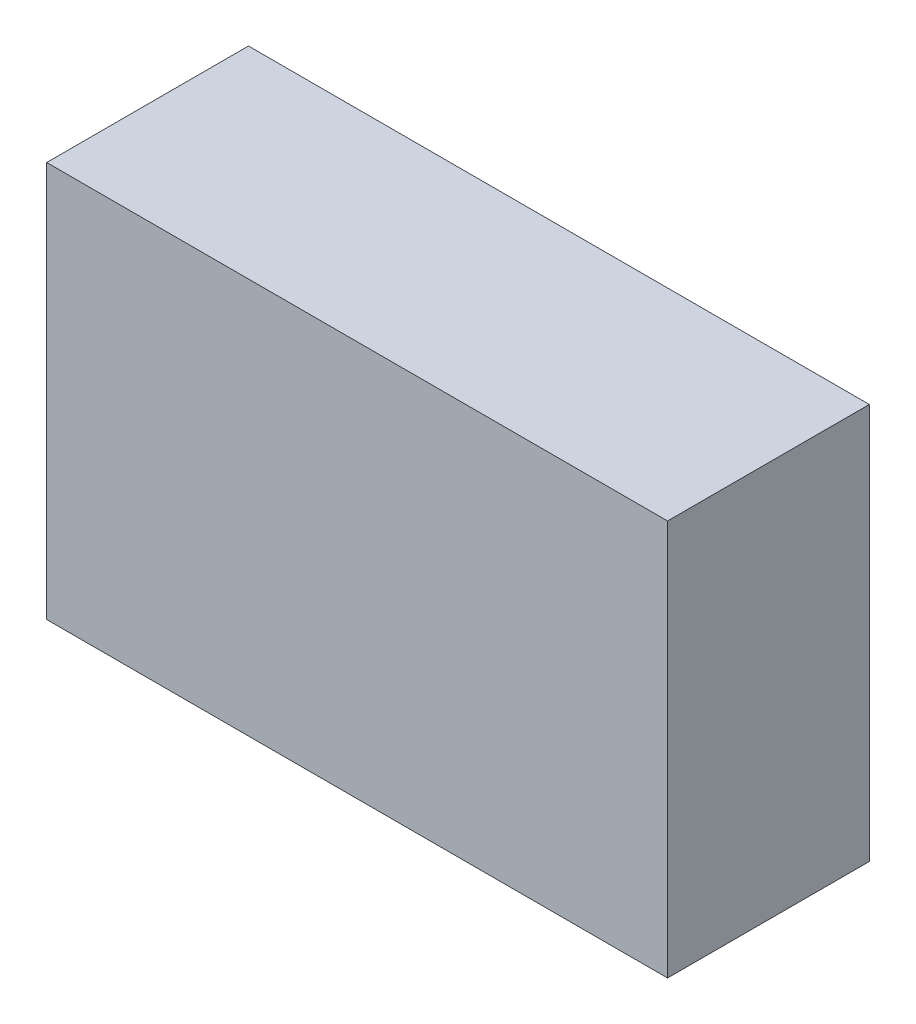
ISO-10303-21;
HEADER;
FILE_DESCRIPTION(('STEP AP214'),'2;1');
FILE_NAME('part.step','',(''),(''),'','','');
FILE_SCHEMA(('AUTOMOTIVE_DESIGN { 1 0 10303 214 1 1 1 1 }'));
ENDSEC;
DATA;
#1=APPLICATION_CONTEXT('core data for automotive mechanical design processes');
#2=APPLICATION_PROTOCOL_DEFINITION('international standard','automotive_design',2000,#1);
#3=PRODUCT_CONTEXT('',#1,'mechanical');
#4=PRODUCT('Part','Part','',(#3));
#5=PRODUCT_RELATED_PRODUCT_CATEGORY('part','',(#4));
#6=PRODUCT_DEFINITION_FORMATION('','',#4);
#7=PRODUCT_DEFINITION_CONTEXT('part definition',#1,'design');
#8=PRODUCT_DEFINITION('design','',#6,#7);
#9=PRODUCT_DEFINITION_SHAPE('','',#8);
#10=(LENGTH_UNIT() NAMED_UNIT(*) SI_UNIT(.MILLI.,.METRE.));
#11=(NAMED_UNIT(*) PLANE_ANGLE_UNIT() SI_UNIT($,.RADIAN.));
#12=(NAMED_UNIT(*) SI_UNIT($,.STERADIAN.) SOLID_ANGLE_UNIT());
#13=UNCERTAINTY_MEASURE_WITH_UNIT(LENGTH_MEASURE(1.E-05),#10,'distance_accuracy_value','');
#14=(GEOMETRIC_REPRESENTATION_CONTEXT(3) GLOBAL_UNCERTAINTY_ASSIGNED_CONTEXT((#13)) GLOBAL_UNIT_ASSIGNED_CONTEXT((#10,
#11,#12)) REPRESENTATION_CONTEXT('',''));
#15=CARTESIAN_POINT('',(0.,0.,0.));
#16=DIRECTION('',(0.,0.,1.));
#17=DIRECTION('',(1.,0.,0.));
#18=AXIS2_PLACEMENT_3D('',#15,#16,#17);
#19=CARTESIAN_POINT('',(-32.,-132.9,228.6));
#20=DIRECTION('',(0.,0.,1.));
#21=DIRECTION('',(1.,0.,0.));
#22=AXIS2_PLACEMENT_3D('',#19,#20,#21);
#23=PLANE('',#22);
#24=DIRECTION('',(0.,-1.,0.));
#25=VECTOR('',#24,1.);
#26=CARTESIAN_POINT('',(-32.,-132.9,228.6));
#27=LINE('',#26,#25);
#28=CARTESIAN_POINT('',(-32.,-132.9,228.6));
#29=VERTEX_POINT('',#28);
#30=CARTESIAN_POINT('',(-32.,-143.1,228.6));
#31=VERTEX_POINT('',#30);
#32=EDGE_CURVE('E69',#29,#31,#27,.T.);
#33=ORIENTED_EDGE('',*,*,#32,.F.);
#34=DIRECTION('',(-1.,0.,0.));
#35=VECTOR('',#34,1.);
#36=CARTESIAN_POINT('',(-32.,-132.9,228.6));
#37=LINE('',#36,#35);
#38=CARTESIAN_POINT('',(-48.,-132.9,228.6));
#39=VERTEX_POINT('',#38);
#40=EDGE_CURVE('E64',#29,#39,#37,.T.);
#41=ORIENTED_EDGE('',*,*,#40,.T.);
#42=DIRECTION('',(0.,-1.,0.));
#43=VECTOR('',#42,1.);
#44=CARTESIAN_POINT('',(-48.,-132.9,228.6));
#45=LINE('',#44,#43);
#46=CARTESIAN_POINT('',(-48.,-143.1,228.6));
#47=VERTEX_POINT('',#46);
#48=EDGE_CURVE('E66',#39,#47,#45,.T.);
#49=ORIENTED_EDGE('',*,*,#48,.T.);
#50=DIRECTION('',(-1.,0.,0.));
#51=VECTOR('',#50,1.);
#52=CARTESIAN_POINT('',(-32.,-143.1,228.6));
#53=LINE('',#52,#51);
#54=EDGE_CURVE('E10',#31,#47,#53,.T.);
#55=ORIENTED_EDGE('',*,*,#54,.F.);
#56=EDGE_LOOP('',(#33,#41,#49,#55));
#57=FACE_BOUND('',#56,.T.);
#58=ADVANCED_FACE('F15',(#57),#23,.T.);
#59=CARTESIAN_POINT('',(-32.,-132.9,223.4));
#60=DIRECTION('',(0.,0.,1.));
#61=DIRECTION('',(1.,0.,0.));
#62=AXIS2_PLACEMENT_3D('',#59,#60,#61);
#63=PLANE('',#62);
#64=DIRECTION('',(-1.,0.,0.));
#65=VECTOR('',#64,1.);
#66=CARTESIAN_POINT('',(-32.,-143.1,223.4));
#67=LINE('',#66,#65);
#68=CARTESIAN_POINT('',(-32.,-143.1,223.4));
#69=VERTEX_POINT('',#68);
#70=CARTESIAN_POINT('',(-48.,-143.1,223.4));
#71=VERTEX_POINT('',#70);
#72=EDGE_CURVE('E26',#69,#71,#67,.T.);
#73=ORIENTED_EDGE('',*,*,#72,.T.);
#74=DIRECTION('',(0.,-1.,0.));
#75=VECTOR('',#74,1.);
#76=CARTESIAN_POINT('',(-48.,-132.9,223.4));
#77=LINE('',#76,#75);
#78=CARTESIAN_POINT('',(-48.,-132.9,223.4));
#79=VERTEX_POINT('',#78);
#80=EDGE_CURVE('E87',#79,#71,#77,.T.);
#81=ORIENTED_EDGE('',*,*,#80,.F.);
#82=DIRECTION('',(-1.,0.,0.));
#83=VECTOR('',#82,1.);
#84=CARTESIAN_POINT('',(-32.,-132.9,223.4));
#85=LINE('',#84,#83);
#86=CARTESIAN_POINT('',(-32.,-132.9,223.4));
#87=VERTEX_POINT('',#86);
#88=EDGE_CURVE('E75',#87,#79,#85,.T.);
#89=ORIENTED_EDGE('',*,*,#88,.F.);
#90=DIRECTION('',(0.,-1.,0.));
#91=VECTOR('',#90,1.);
#92=CARTESIAN_POINT('',(-32.,-132.9,223.4));
#93=LINE('',#92,#91);
#94=EDGE_CURVE('E95',#87,#69,#93,.T.);
#95=ORIENTED_EDGE('',*,*,#94,.T.);
#96=EDGE_LOOP('',(#73,#81,#89,#95));
#97=FACE_BOUND('',#96,.T.);
#98=ADVANCED_FACE('F115',(#97),#63,.F.);
#99=CARTESIAN_POINT('',(-32.,-143.1,223.4));
#100=DIRECTION('',(0.,-1.,0.));
#101=DIRECTION('',(0.,0.,-1.));
#102=AXIS2_PLACEMENT_3D('',#99,#100,#101);
#103=PLANE('',#102);
#104=ORIENTED_EDGE('',*,*,#72,.F.);
#105=DIRECTION('',(0.,0.,1.));
#106=VECTOR('',#105,1.);
#107=CARTESIAN_POINT('',(-32.,-143.1,223.4));
#108=LINE('',#107,#106);
#109=EDGE_CURVE('E101',#69,#31,#108,.T.);
#110=ORIENTED_EDGE('',*,*,#109,.T.);
#111=ORIENTED_EDGE('',*,*,#54,.T.);
#112=DIRECTION('',(0.,0.,1.));
#113=VECTOR('',#112,1.);
#114=CARTESIAN_POINT('',(-48.,-143.1,223.4));
#115=LINE('',#114,#113);
#116=EDGE_CURVE('E19',#71,#47,#115,.T.);
#117=ORIENTED_EDGE('',*,*,#116,.F.);
#118=EDGE_LOOP('',(#104,#110,#111,#117));
#119=FACE_BOUND('',#118,.T.);
#120=ADVANCED_FACE('F116',(#119),#103,.T.);
#121=CARTESIAN_POINT('',(-32.,-132.9,223.4));
#122=DIRECTION('',(0.,-1.,0.));
#123=DIRECTION('',(0.,0.,-1.));
#124=AXIS2_PLACEMENT_3D('',#121,#122,#123);
#125=PLANE('',#124);
#126=DIRECTION('',(0.,0.,1.));
#127=VECTOR('',#126,1.);
#128=CARTESIAN_POINT('',(-48.,-132.9,223.4));
#129=LINE('',#128,#127);
#130=EDGE_CURVE('E80',#79,#39,#129,.T.);
#131=ORIENTED_EDGE('',*,*,#130,.T.);
#132=ORIENTED_EDGE('',*,*,#40,.F.);
#133=DIRECTION('',(0.,0.,1.));
#134=VECTOR('',#133,1.);
#135=CARTESIAN_POINT('',(-32.,-132.9,223.4));
#136=LINE('',#135,#134);
#137=EDGE_CURVE('E88',#87,#29,#136,.T.);
#138=ORIENTED_EDGE('',*,*,#137,.F.);
#139=ORIENTED_EDGE('',*,*,#88,.T.);
#140=EDGE_LOOP('',(#131,#132,#138,#139));
#141=FACE_BOUND('',#140,.T.);
#142=ADVANCED_FACE('F83',(#141),#125,.F.);
#143=CARTESIAN_POINT('',(-48.,-132.9,223.4));
#144=DIRECTION('',(-1.,0.,0.));
#145=DIRECTION('',(0.,0.,1.));
#146=AXIS2_PLACEMENT_3D('',#143,#144,#145);
#147=PLANE('',#146);
#148=ORIENTED_EDGE('',*,*,#130,.F.);
#149=ORIENTED_EDGE('',*,*,#80,.T.);
#150=ORIENTED_EDGE('',*,*,#116,.T.);
#151=ORIENTED_EDGE('',*,*,#48,.F.);
#152=EDGE_LOOP('',(#148,#149,#150,#151));
#153=FACE_BOUND('',#152,.T.);
#154=ADVANCED_FACE('F17',(#153),#147,.T.);
#155=CARTESIAN_POINT('',(-32.,-132.9,223.4));
#156=DIRECTION('',(-1.,0.,0.));
#157=DIRECTION('',(0.,0.,1.));
#158=AXIS2_PLACEMENT_3D('',#155,#156,#157);
#159=PLANE('',#158);
#160=ORIENTED_EDGE('',*,*,#32,.T.);
#161=ORIENTED_EDGE('',*,*,#109,.F.);
#162=ORIENTED_EDGE('',*,*,#94,.F.);
#163=ORIENTED_EDGE('',*,*,#137,.T.);
#164=EDGE_LOOP('',(#160,#161,#162,#163));
#165=FACE_BOUND('',#164,.T.);
#166=ADVANCED_FACE('F134',(#165),#159,.F.);
#167=CLOSED_SHELL('',(#58,#98,#120,#142,#154,#166));
#168=MANIFOLD_SOLID_BREP('B1',#167);
#169=ADVANCED_BREP_SHAPE_REPRESENTATION('',(#18,#168),#14);
#170=SHAPE_DEFINITION_REPRESENTATION(#9,#169);
ENDSEC;
END-ISO-10303-21;
